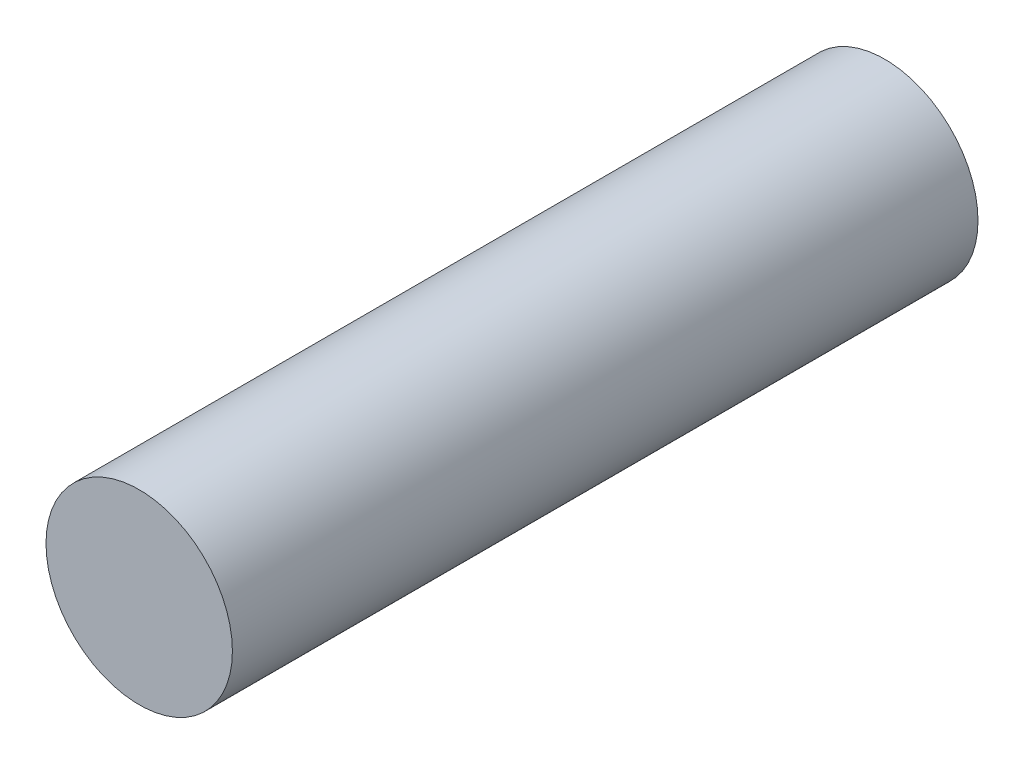
ISO-10303-21;
HEADER;
FILE_DESCRIPTION(('STEP AP214'),'2;1');
FILE_NAME('part.step','',(''),(''),'','','');
FILE_SCHEMA(('AUTOMOTIVE_DESIGN { 1 0 10303 214 1 1 1 1 }'));
ENDSEC;
DATA;
#1=APPLICATION_CONTEXT('core data for automotive mechanical design processes');
#2=APPLICATION_PROTOCOL_DEFINITION('international standard','automotive_design',2000,#1);
#3=PRODUCT_CONTEXT('',#1,'mechanical');
#4=PRODUCT('Part','Part','',(#3));
#5=PRODUCT_RELATED_PRODUCT_CATEGORY('part','',(#4));
#6=PRODUCT_DEFINITION_FORMATION('','',#4);
#7=PRODUCT_DEFINITION_CONTEXT('part definition',#1,'design');
#8=PRODUCT_DEFINITION('design','',#6,#7);
#9=PRODUCT_DEFINITION_SHAPE('','',#8);
#10=(LENGTH_UNIT() NAMED_UNIT(*) SI_UNIT(.MILLI.,.METRE.));
#11=(NAMED_UNIT(*) PLANE_ANGLE_UNIT() SI_UNIT($,.RADIAN.));
#12=(NAMED_UNIT(*) SI_UNIT($,.STERADIAN.) SOLID_ANGLE_UNIT());
#13=UNCERTAINTY_MEASURE_WITH_UNIT(LENGTH_MEASURE(1.E-05),#10,'distance_accuracy_value','');
#14=(GEOMETRIC_REPRESENTATION_CONTEXT(3) GLOBAL_UNCERTAINTY_ASSIGNED_CONTEXT((#13)) GLOBAL_UNIT_ASSIGNED_CONTEXT((#10,
#11,#12)) REPRESENTATION_CONTEXT('',''));
#15=CARTESIAN_POINT('',(0.,0.,0.));
#16=DIRECTION('',(0.,0.,1.));
#17=DIRECTION('',(1.,0.,0.));
#18=AXIS2_PLACEMENT_3D('',#15,#16,#17);
#19=CARTESIAN_POINT('',(0.,0.,600.));
#20=DIRECTION('',(0.,0.,-1.));
#21=DIRECTION('',(-1.,0.,0.));
#22=AXIS2_PLACEMENT_3D('',#19,#20,#21);
#23=CYLINDRICAL_SURFACE('',#22,75.);
#24=CARTESIAN_POINT('',(0.,0.,600.));
#25=DIRECTION('',(0.,0.,1.));
#26=DIRECTION('',(1.,0.,0.));
#27=AXIS2_PLACEMENT_3D('',#24,#25,#26);
#28=CIRCLE('',#27,75.);
#29=CARTESIAN_POINT('',(75.,0.,600.));
#30=VERTEX_POINT('',#29);
#31=EDGE_CURVE('E10',#30,#30,#28,.T.);
#32=ORIENTED_EDGE('',*,*,#31,.F.);
#33=EDGE_LOOP('',(#32));
#34=FACE_BOUND('',#33,.T.);
#35=CARTESIAN_POINT('',(0.,0.,0.));
#36=DIRECTION('',(0.,0.,1.));
#37=DIRECTION('',(1.,0.,0.));
#38=AXIS2_PLACEMENT_3D('',#35,#36,#37);
#39=CIRCLE('',#38,75.);
#40=CARTESIAN_POINT('',(75.,0.,0.));
#41=VERTEX_POINT('',#40);
#42=EDGE_CURVE('E44',#41,#41,#39,.T.);
#43=ORIENTED_EDGE('',*,*,#42,.T.);
#44=EDGE_LOOP('',(#43));
#45=FACE_BOUND('',#44,.T.);
#46=ADVANCED_FACE('F41',(#34,#45),#23,.T.);
#47=CARTESIAN_POINT('',(0.,0.,600.));
#48=DIRECTION('',(0.,0.,1.));
#49=DIRECTION('',(1.,0.,0.));
#50=AXIS2_PLACEMENT_3D('',#47,#48,#49);
#51=PLANE('',#50);
#52=ORIENTED_EDGE('',*,*,#31,.T.);
#53=EDGE_LOOP('',(#52));
#54=FACE_BOUND('',#53,.T.);
#55=ADVANCED_FACE('F74',(#54),#51,.T.);
#56=CARTESIAN_POINT('',(0.,0.,0.));
#57=DIRECTION('',(0.,0.,1.));
#58=DIRECTION('',(1.,0.,0.));
#59=AXIS2_PLACEMENT_3D('',#56,#57,#58);
#60=PLANE('',#59);
#61=CARTESIAN_POINT('',(0.,0.,0.));
#62=DIRECTION('',(0.,0.,-1.));
#63=DIRECTION('',(-1.,0.,0.));
#64=AXIS2_PLACEMENT_3D('',#61,#62,#63);
#65=CIRCLE('',#64,37.5);
#66=CARTESIAN_POINT('',(-37.5,0.,0.));
#67=VERTEX_POINT('',#66);
#68=EDGE_CURVE('E55',#67,#67,#65,.T.);
#69=ORIENTED_EDGE('',*,*,#68,.F.);
#70=EDGE_LOOP('',(#69));
#71=FACE_BOUND('',#70,.T.);
#72=ORIENTED_EDGE('',*,*,#42,.F.);
#73=EDGE_LOOP('',(#72));
#74=FACE_BOUND('',#73,.T.);
#75=ADVANCED_FACE('F68',(#71,#74),#60,.F.);
#76=CARTESIAN_POINT('',(0.,0.,500.));
#77=DIRECTION('',(0.,0.,-1.));
#78=DIRECTION('',(-1.,0.,0.));
#79=AXIS2_PLACEMENT_3D('',#76,#77,#78);
#80=CYLINDRICAL_SURFACE('',#79,37.5);
#81=CARTESIAN_POINT('',(0.,0.,500.));
#82=DIRECTION('',(0.,0.,-1.));
#83=DIRECTION('',(-1.,0.,0.));
#84=AXIS2_PLACEMENT_3D('',#81,#82,#83);
#85=CIRCLE('',#84,37.5);
#86=CARTESIAN_POINT('',(-37.5,0.,500.));
#87=VERTEX_POINT('',#86);
#88=EDGE_CURVE('E53',#87,#87,#85,.T.);
#89=ORIENTED_EDGE('',*,*,#88,.F.);
#90=EDGE_LOOP('',(#89));
#91=FACE_BOUND('',#90,.T.);
#92=ORIENTED_EDGE('',*,*,#68,.T.);
#93=EDGE_LOOP('',(#92));
#94=FACE_BOUND('',#93,.T.);
#95=ADVANCED_FACE('F65',(#91,#94),#80,.F.);
#96=CARTESIAN_POINT('',(0.,0.,500.));
#97=DIRECTION('',(0.,0.,-1.));
#98=DIRECTION('',(-1.,0.,0.));
#99=AXIS2_PLACEMENT_3D('',#96,#97,#98);
#100=PLANE('',#99);
#101=ORIENTED_EDGE('',*,*,#88,.T.);
#102=EDGE_LOOP('',(#101));
#103=FACE_BOUND('',#102,.T.);
#104=ADVANCED_FACE('F63',(#103),#100,.T.);
#105=CLOSED_SHELL('',(#46,#55,#75,#95,#104));
#106=MANIFOLD_SOLID_BREP('B2',#105);
#107=ADVANCED_BREP_SHAPE_REPRESENTATION('',(#18,#106),#14);
#108=SHAPE_DEFINITION_REPRESENTATION(#9,#107);
ENDSEC;
END-ISO-10303-21;
